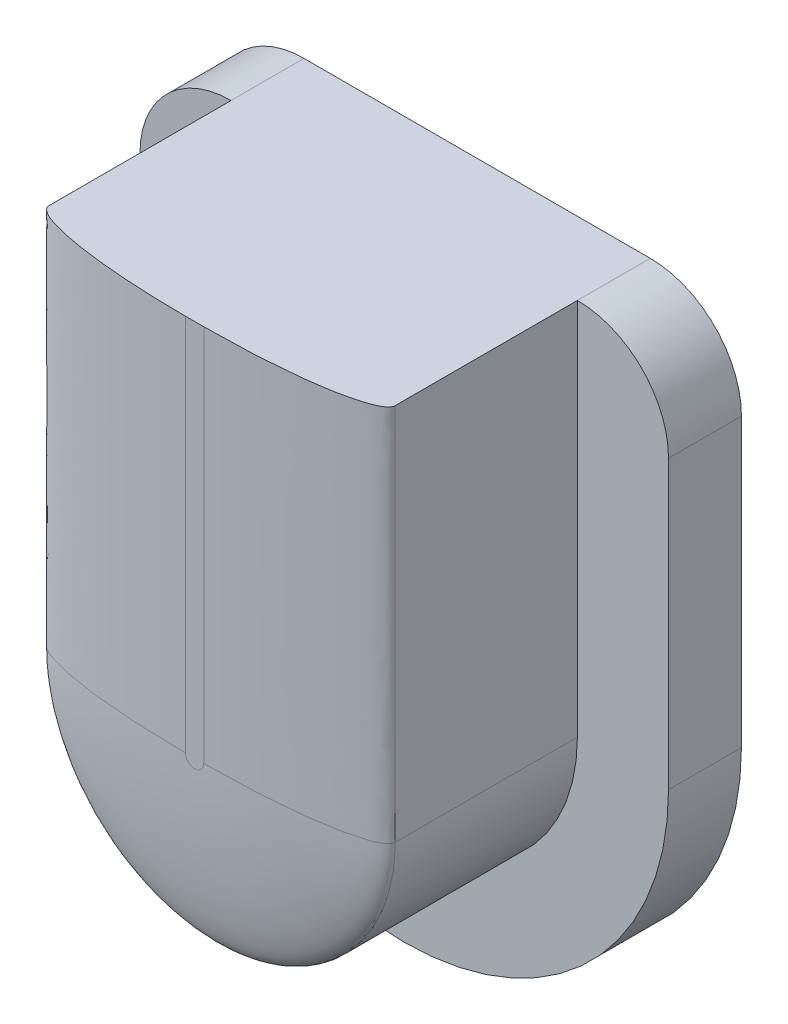
ISO-10303-21;
HEADER;
FILE_DESCRIPTION(('STEP AP214'),'2;1');
FILE_NAME('part.step','',(''),(''),'','','');
FILE_SCHEMA(('AUTOMOTIVE_DESIGN { 1 0 10303 214 1 1 1 1 }'));
ENDSEC;
DATA;
#1=APPLICATION_CONTEXT('core data for automotive mechanical design processes');
#2=APPLICATION_PROTOCOL_DEFINITION('international standard','automotive_design',2000,#1);
#3=PRODUCT_CONTEXT('',#1,'mechanical');
#4=PRODUCT('Part','Part','',(#3));
#5=PRODUCT_RELATED_PRODUCT_CATEGORY('part','',(#4));
#6=PRODUCT_DEFINITION_FORMATION('','',#4);
#7=PRODUCT_DEFINITION_CONTEXT('part definition',#1,'design');
#8=PRODUCT_DEFINITION('design','',#6,#7);
#9=PRODUCT_DEFINITION_SHAPE('','',#8);
#10=(LENGTH_UNIT() NAMED_UNIT(*) SI_UNIT(.MILLI.,.METRE.));
#11=(NAMED_UNIT(*) PLANE_ANGLE_UNIT() SI_UNIT($,.RADIAN.));
#12=(NAMED_UNIT(*) SI_UNIT($,.STERADIAN.) SOLID_ANGLE_UNIT());
#13=UNCERTAINTY_MEASURE_WITH_UNIT(LENGTH_MEASURE(1.E-05),#10,'distance_accuracy_value','');
#14=(GEOMETRIC_REPRESENTATION_CONTEXT(3) GLOBAL_UNCERTAINTY_ASSIGNED_CONTEXT((#13)) GLOBAL_UNIT_ASSIGNED_CONTEXT((#10,
#11,#12)) REPRESENTATION_CONTEXT('',''));
#15=CARTESIAN_POINT('',(0.,0.,0.));
#16=DIRECTION('',(0.,0.,1.));
#17=DIRECTION('',(1.,0.,0.));
#18=AXIS2_PLACEMENT_3D('',#15,#16,#17);
#19=CARTESIAN_POINT('',(0.600000000000001,-78.2729999997179,3.1));
#20=DIRECTION('',(0.,0.,-1.));
#21=DIRECTION('',(-1.,0.,0.));
#22=AXIS2_PLACEMENT_3D('',#19,#20,#21);
#23=CYLINDRICAL_SURFACE('',#22,1.9);
#24=DIRECTION('',(0.,0.,-1.));
#25=VECTOR('',#24,1.);
#26=CARTESIAN_POINT('',(2.5,-78.2729999997179,3.1));
#27=LINE('',#26,#25);
#28=CARTESIAN_POINT('',(2.5,-78.2729999997179,2.8));
#29=VERTEX_POINT('',#28);
#30=CARTESIAN_POINT('',(2.5,-78.2729999997179,0.800000000000001));
#31=VERTEX_POINT('',#30);
#32=EDGE_CURVE('E252',#29,#31,#27,.T.);
#33=ORIENTED_EDGE('',*,*,#32,.F.);
#34=CARTESIAN_POINT('',(-1.3,-78.2729999997179,2.8));
#35=CARTESIAN_POINT('',(-1.3,-78.5217513835236,2.8));
#36=CARTESIAN_POINT('',(-1.25054649939496,-78.7703248096067,2.8));
#37=CARTESIAN_POINT('',(-1.06019572414801,-79.2298722328163,2.8));
#38=CARTESIAN_POINT('',(-0.919364069502486,-79.4406416987243,2.8));
#39=CARTESIAN_POINT('',(-0.567641699006299,-79.7923640692205,2.8));
#40=CARTESIAN_POINT('',(-0.356872233098459,-79.9331957238659,2.8));
#41=CARTESIAN_POINT('',(0.102675190111133,-80.1235464991129,2.8));
#42=CARTESIAN_POINT('',(0.351294726727069,-80.1729999997179,2.8));
#43=CARTESIAN_POINT('',(0.848705273272936,-80.1729999997179,2.8));
#44=CARTESIAN_POINT('',(1.09732480988882,-80.1235464991129,2.8));
#45=CARTESIAN_POINT('',(1.5568722330985,-79.9331957238658,2.8));
#46=CARTESIAN_POINT('',(1.76764169900635,-79.7923640692205,2.8));
#47=CARTESIAN_POINT('',(2.11936406950244,-79.4406416987244,2.8));
#48=CARTESIAN_POINT('',(2.26019572414801,-79.2298722328163,2.8));
#49=CARTESIAN_POINT('',(2.45054649939496,-78.7703248096067,2.8));
#50=CARTESIAN_POINT('',(2.5,-78.5217513835236,2.8));
#51=CARTESIAN_POINT('',(2.5,-78.2729999997179,2.8));
#52=(BOUNDED_CURVE() B_SPLINE_CURVE(3,(#34,#35,#36,#37,#38,#39,#40,#41,#42,#43,#44,#45,#46,#47,
#48,#49,#50,#51),.UNSPECIFIED.,.F.,.F.) B_SPLINE_CURVE_WITH_KNOTS((4,2,2,2,2,2,2,2,4),
(3.14159265358979,3.53429173528852,3.92699081698724,4.31968989868597,4.71238898038469,
5.10508806208341,5.49778714378214,5.89048622548086,6.28318530717959),
.UNSPECIFIED.) CURVE() GEOMETRIC_REPRESENTATION_ITEM() RATIONAL_B_SPLINE_CURVE((1.,1.,1.,1.,1.,
1.,1.,1.,1.,1.,1.,1.,1.,1.,1.,1.,1.,1.)) REPRESENTATION_ITEM(''));
#53=CARTESIAN_POINT('',(-1.3,-78.2729999997179,2.8));
#54=VERTEX_POINT('',#53);
#55=EDGE_CURVE('E153',#29,#54,#52,.F.);
#56=ORIENTED_EDGE('',*,*,#55,.T.);
#57=DIRECTION('',(0.,0.,-1.));
#58=VECTOR('',#57,1.);
#59=CARTESIAN_POINT('',(-1.3,-78.2729999997179,3.1));
#60=LINE('',#59,#58);
#61=CARTESIAN_POINT('',(-1.3,-78.2729999997179,0.800000000000001));
#62=VERTEX_POINT('',#61);
#63=EDGE_CURVE('E255',#54,#62,#60,.T.);
#64=ORIENTED_EDGE('',*,*,#63,.T.);
#65=CARTESIAN_POINT('',(0.600000000000001,-78.2729999997179,0.8));
#66=DIRECTION('',(0.,0.,-1.));
#67=DIRECTION('',(-1.,0.,0.));
#68=AXIS2_PLACEMENT_3D('',#65,#66,#67);
#69=CIRCLE('',#68,1.9);
#70=EDGE_CURVE('E263',#31,#62,#69,.T.);
#71=ORIENTED_EDGE('',*,*,#70,.F.);
#72=EDGE_LOOP('',(#33,#56,#64,#71));
#73=FACE_BOUND('',#72,.T.);
#74=ADVANCED_FACE('F40',(#73),#23,.T.);
#75=CARTESIAN_POINT('',(2.5,-78.2729999997179,3.1));
#76=DIRECTION('',(-1.,0.,0.));
#77=DIRECTION('',(0.,-1.,0.));
#78=AXIS2_PLACEMENT_3D('',#75,#76,#77);
#79=PLANE('',#78);
#80=DIRECTION('',(0.,-1.,0.));
#81=VECTOR('',#80,1.);
#82=CARTESIAN_POINT('',(2.5,-78.2729999997179,0.8));
#83=LINE('',#82,#81);
#84=CARTESIAN_POINT('',(2.5,-74.1229995629388,0.800000000000001));
#85=VERTEX_POINT('',#84);
#86=EDGE_CURVE('E143',#85,#31,#83,.T.);
#87=ORIENTED_EDGE('',*,*,#86,.F.);
#88=DIRECTION('',(0.,0.,1.));
#89=VECTOR('',#88,1.);
#90=CARTESIAN_POINT('',(2.5,-74.1229995629388,3.1));
#91=LINE('',#90,#89);
#92=CARTESIAN_POINT('',(2.5,-74.1229995629388,2.8));
#93=VERTEX_POINT('',#92);
#94=EDGE_CURVE('E126',#85,#93,#91,.T.);
#95=ORIENTED_EDGE('',*,*,#94,.T.);
#96=CARTESIAN_POINT('',(2.5,-78.2729999997179,2.8));
#97=CARTESIAN_POINT('',(2.5,-72.7396660840124,2.8));
#98=CARTESIAN_POINT('',(2.5,-67.2063321683071,2.8));
#99=CARTESIAN_POINT('',(2.5,-61.6729982526016,2.8));
#100=(BOUNDED_CURVE() B_SPLINE_CURVE(3,(#96,#97,#98,#99),.UNSPECIFIED.,.F.,
.F.) B_SPLINE_CURVE_WITH_KNOTS((4,4),(-0.0166000017471164,0.),
.UNSPECIFIED.) CURVE() GEOMETRIC_REPRESENTATION_ITEM() RATIONAL_B_SPLINE_CURVE((1.,1.,1.,1.)) REPRESENTATION_ITEM(''));
#101=EDGE_CURVE('E140',#93,#29,#100,.F.);
#102=ORIENTED_EDGE('',*,*,#101,.T.);
#103=ORIENTED_EDGE('',*,*,#32,.T.);
#104=EDGE_LOOP('',(#87,#95,#102,#103));
#105=FACE_BOUND('',#104,.T.);
#106=ADVANCED_FACE('F138',(#105),#79,.F.);
#107=CARTESIAN_POINT('',(-1.3,-78.2729999997179,3.1));
#108=DIRECTION('',(1.,0.,0.));
#109=DIRECTION('',(0.,0.,-1.));
#110=AXIS2_PLACEMENT_3D('',#107,#108,#109);
#111=PLANE('',#110);
#112=CARTESIAN_POINT('',(-1.3,-61.6729982526016,2.8));
#113=CARTESIAN_POINT('',(-1.3,-67.2063321683071,2.8));
#114=CARTESIAN_POINT('',(-1.3,-72.7396660840124,2.8));
#115=CARTESIAN_POINT('',(-1.3,-78.2729999997179,2.8));
#116=(BOUNDED_CURVE() B_SPLINE_CURVE(3,(#112,#113,#114,#115),.UNSPECIFIED.,.F.,
.F.) B_SPLINE_CURVE_WITH_KNOTS((4,4),(0.,0.0166000017471164),
.UNSPECIFIED.) CURVE() GEOMETRIC_REPRESENTATION_ITEM() RATIONAL_B_SPLINE_CURVE((1.,1.,1.,1.)) REPRESENTATION_ITEM(''));
#117=CARTESIAN_POINT('',(-1.3,-74.1229995629388,2.8));
#118=VERTEX_POINT('',#117);
#119=EDGE_CURVE('E444',#54,#118,#116,.F.);
#120=ORIENTED_EDGE('',*,*,#119,.T.);
#121=DIRECTION('',(0.,0.,-1.));
#122=VECTOR('',#121,1.);
#123=CARTESIAN_POINT('',(-1.3,-74.1229995629388,3.1));
#124=LINE('',#123,#122);
#125=CARTESIAN_POINT('',(-1.3,-74.1229995629388,0.8));
#126=VERTEX_POINT('',#125);
#127=EDGE_CURVE('E335',#118,#126,#124,.T.);
#128=ORIENTED_EDGE('',*,*,#127,.T.);
#129=DIRECTION('',(0.,1.,0.));
#130=VECTOR('',#129,1.);
#131=CARTESIAN_POINT('',(-1.3,-78.2729999997179,0.8));
#132=LINE('',#131,#130);
#133=EDGE_CURVE('E269',#62,#126,#132,.T.);
#134=ORIENTED_EDGE('',*,*,#133,.F.);
#135=ORIENTED_EDGE('',*,*,#63,.F.);
#136=EDGE_LOOP('',(#120,#128,#134,#135));
#137=FACE_BOUND('',#136,.T.);
#138=ADVANCED_FACE('F233',(#137),#111,.F.);
#139=CARTESIAN_POINT('',(0.600000000000001,-78.2729999997179,3.1));
#140=DIRECTION('',(0.,0.,1.));
#141=DIRECTION('',(1.,0.,0.));
#142=AXIS2_PLACEMENT_3D('',#139,#140,#141);
#143=PLANE('',#142);
#144=DIRECTION('',(1.,0.,0.));
#145=VECTOR('',#144,1.);
#146=CARTESIAN_POINT('',(0.600000000000001,-74.1229995629388,3.1));
#147=LINE('',#146,#145);
#148=CARTESIAN_POINT('',(0.5,-74.1229995629388,3.1));
#149=VERTEX_POINT('',#148);
#150=CARTESIAN_POINT('',(0.700000000000001,-74.1229995629388,3.1));
#151=VERTEX_POINT('',#150);
#152=EDGE_CURVE('E129',#149,#151,#147,.T.);
#153=ORIENTED_EDGE('',*,*,#152,.F.);
#154=CARTESIAN_POINT('',(0.5,-78.2729999997179,3.1));
#155=CARTESIAN_POINT('',(0.5,-72.7396660840124,3.1));
#156=CARTESIAN_POINT('',(0.5,-67.2063321683071,3.1));
#157=CARTESIAN_POINT('',(0.5,-61.6729982526016,3.1));
#158=(BOUNDED_CURVE() B_SPLINE_CURVE(3,(#154,#155,#156,#157),.UNSPECIFIED.,.F.,
.F.) B_SPLINE_CURVE_WITH_KNOTS((4,4),(0.,0.0166000017471164),
.UNSPECIFIED.) CURVE() GEOMETRIC_REPRESENTATION_ITEM() RATIONAL_B_SPLINE_CURVE((1.,1.,1.,1.)) REPRESENTATION_ITEM(''));
#159=CARTESIAN_POINT('',(0.5,-78.2729999997179,3.1));
#160=VERTEX_POINT('',#159);
#161=EDGE_CURVE('E272',#149,#160,#158,.F.);
#162=ORIENTED_EDGE('',*,*,#161,.T.);
#163=CARTESIAN_POINT('',(0.700000000000001,-78.2729999997179,3.1));
#164=CARTESIAN_POINT('',(0.699999996727121,-78.2860921778099,3.1));
#165=CARTESIAN_POINT('',(0.697397184178676,-78.2991749897121,3.1));
#166=CARTESIAN_POINT('',(0.687378722323582,-78.3233616961968,3.1));
#167=CARTESIAN_POINT('',(0.679966529973821,-78.3344548259814,3.1));
#168=CARTESIAN_POINT('',(0.66145482626349,-78.3529665296917,3.1));
#169=CARTESIAN_POINT('',(0.650361696478852,-78.3603787220415,3.1));
#170=CARTESIAN_POINT('',(0.626174989994167,-78.3703971838967,3.1));
#171=CARTESIAN_POINT('',(0.613089751224892,-78.3729999997179,3.1));
#172=CARTESIAN_POINT('',(0.586910248775109,-78.3729999997179,3.1));
#173=CARTESIAN_POINT('',(0.573825010005833,-78.3703971838967,3.1));
#174=CARTESIAN_POINT('',(0.54963830352115,-78.3603787220415,3.1));
#175=CARTESIAN_POINT('',(0.538545173736512,-78.3529665296917,3.1));
#176=CARTESIAN_POINT('',(0.52003347002618,-78.3344548259814,3.1));
#177=CARTESIAN_POINT('',(0.512621277676419,-78.3233616961968,3.1));
#178=CARTESIAN_POINT('',(0.502602815821325,-78.2991749897121,3.1));
#179=CARTESIAN_POINT('',(0.50000000327288,-78.2860921778099,3.1));
#180=CARTESIAN_POINT('',(0.5,-78.2729999997179,3.1));
#181=(BOUNDED_CURVE() B_SPLINE_CURVE(3,(#163,#164,#165,#166,#167,#168,#169,#170,#171,#172,#173,
#174,#175,#176,#177,#178,#179,#180),.UNSPECIFIED.,.F.,.F.) B_SPLINE_CURVE_WITH_KNOTS((4,2,2,2,2,
2,2,2,4),(3.14159265358979,3.53429173528852,3.92699081698724,4.31968989868597,4.71238898038469,
5.10508806208341,5.49778714378214,5.89048622548086,6.28318530717959),
.UNSPECIFIED.) CURVE() GEOMETRIC_REPRESENTATION_ITEM() RATIONAL_B_SPLINE_CURVE((1.,1.,1.,1.,1.,
1.,1.,1.,1.,1.,1.,1.,1.,1.,1.,1.,1.,1.)) REPRESENTATION_ITEM(''));
#182=CARTESIAN_POINT('',(0.700000000000001,-78.2729999997179,3.1));
#183=VERTEX_POINT('',#182);
#184=EDGE_CURVE('E219',#160,#183,#181,.F.);
#185=ORIENTED_EDGE('',*,*,#184,.T.);
#186=CARTESIAN_POINT('',(0.7,-61.6729982526016,3.1));
#187=CARTESIAN_POINT('',(0.7,-67.2063321683071,3.1));
#188=CARTESIAN_POINT('',(0.700000000000001,-72.7396660840124,3.1));
#189=CARTESIAN_POINT('',(0.700000000000001,-78.2729999997179,3.1));
#190=(BOUNDED_CURVE() B_SPLINE_CURVE(3,(#186,#187,#188,#189),.UNSPECIFIED.,.F.,
.F.) B_SPLINE_CURVE_WITH_KNOTS((4,4),(-0.0166000017471164,0.),
.UNSPECIFIED.) CURVE() GEOMETRIC_REPRESENTATION_ITEM() RATIONAL_B_SPLINE_CURVE((1.,1.,1.,1.)) REPRESENTATION_ITEM(''));
#191=EDGE_CURVE('E154',#183,#151,#190,.F.);
#192=ORIENTED_EDGE('',*,*,#191,.T.);
#193=EDGE_LOOP('',(#153,#162,#185,#192));
#194=FACE_BOUND('',#193,.T.);
#195=ADVANCED_FACE('F242',(#194),#143,.T.);
#196=CARTESIAN_POINT('',(0.600000000000001,-78.2729999997179,0.8));
#197=DIRECTION('',(0.,0.,-1.));
#198=DIRECTION('',(-1.,0.,0.));
#199=AXIS2_PLACEMENT_3D('',#196,#197,#198);
#200=PLANE('',#199);
#201=ORIENTED_EDGE('',*,*,#133,.T.);
#202=CARTESIAN_POINT('',(-1.3,-75.1229995629388,0.8));
#203=DIRECTION('',(0.,0.,-1.));
#204=DIRECTION('',(-1.,0.,0.));
#205=AXIS2_PLACEMENT_3D('',#202,#203,#204);
#206=CIRCLE('',#205,1.);
#207=CARTESIAN_POINT('',(-2.3,-75.1229995629388,0.8));
#208=VERTEX_POINT('',#207);
#209=EDGE_CURVE('E48',#126,#208,#206,.F.);
#210=ORIENTED_EDGE('',*,*,#209,.T.);
#211=DIRECTION('',(0.,1.,0.));
#212=VECTOR('',#211,1.);
#213=CARTESIAN_POINT('',(-2.3,-78.2729999997179,0.8));
#214=LINE('',#213,#212);
#215=CARTESIAN_POINT('',(-2.3,-78.2729999997179,0.8));
#216=VERTEX_POINT('',#215);
#217=EDGE_CURVE('E408',#216,#208,#214,.T.);
#218=ORIENTED_EDGE('',*,*,#217,.F.);
#219=CARTESIAN_POINT('',(0.600000000000001,-78.2729999997179,0.8));
#220=DIRECTION('',(0.,0.,-1.));
#221=DIRECTION('',(-1.,0.,0.));
#222=AXIS2_PLACEMENT_3D('',#219,#220,#221);
#223=CIRCLE('',#222,2.9);
#224=CARTESIAN_POINT('',(3.5,-78.2729999997179,0.8));
#225=VERTEX_POINT('',#224);
#226=EDGE_CURVE('E419',#225,#216,#223,.T.);
#227=ORIENTED_EDGE('',*,*,#226,.F.);
#228=DIRECTION('',(0.,-1.,0.));
#229=VECTOR('',#228,1.);
#230=CARTESIAN_POINT('',(3.5,-61.6729982526016,0.8));
#231=LINE('',#230,#229);
#232=CARTESIAN_POINT('',(3.5,-75.1229995629388,0.8));
#233=VERTEX_POINT('',#232);
#234=EDGE_CURVE('E418',#233,#225,#231,.T.);
#235=ORIENTED_EDGE('',*,*,#234,.F.);
#236=CARTESIAN_POINT('',(2.5,-75.1229995629388,0.8));
#237=DIRECTION('',(0.,0.,-1.));
#238=DIRECTION('',(-1.,0.,0.));
#239=AXIS2_PLACEMENT_3D('',#236,#237,#238);
#240=CIRCLE('',#239,1.);
#241=EDGE_CURVE('E403',#233,#85,#240,.F.);
#242=ORIENTED_EDGE('',*,*,#241,.T.);
#243=ORIENTED_EDGE('',*,*,#86,.T.);
#244=ORIENTED_EDGE('',*,*,#70,.T.);
#245=EDGE_LOOP('',(#201,#210,#218,#227,#235,#242,#243,#244));
#246=FACE_BOUND('',#245,.T.);
#247=ADVANCED_FACE('F285',(#246),#200,.F.);
#248=CARTESIAN_POINT('',(0.600000000000001,-78.2729999997179,0.8));
#249=DIRECTION('',(0.,0.,-1.));
#250=DIRECTION('',(-1.,0.,0.));
#251=AXIS2_PLACEMENT_3D('',#248,#249,#250);
#252=CYLINDRICAL_SURFACE('',#251,2.9);
#253=CARTESIAN_POINT('',(0.600000000000001,-78.2729999997179,0.));
#254=DIRECTION('',(0.,0.,-1.));
#255=DIRECTION('',(-1.,0.,0.));
#256=AXIS2_PLACEMENT_3D('',#253,#254,#255);
#257=CIRCLE('',#256,2.9);
#258=CARTESIAN_POINT('',(3.5,-78.2729999997179,0.));
#259=VERTEX_POINT('',#258);
#260=CARTESIAN_POINT('',(-2.3,-78.2729999997179,0.));
#261=VERTEX_POINT('',#260);
#262=EDGE_CURVE('E433',#259,#261,#257,.T.);
#263=ORIENTED_EDGE('',*,*,#262,.F.);
#264=DIRECTION('',(0.,0.,-1.));
#265=VECTOR('',#264,1.);
#266=CARTESIAN_POINT('',(3.5,-78.2729999997179,0.8));
#267=LINE('',#266,#265);
#268=EDGE_CURVE('E437',#225,#259,#267,.T.);
#269=ORIENTED_EDGE('',*,*,#268,.F.);
#270=ORIENTED_EDGE('',*,*,#226,.T.);
#271=DIRECTION('',(0.,0.,-1.));
#272=VECTOR('',#271,1.);
#273=CARTESIAN_POINT('',(-2.3,-78.2729999997179,0.8));
#274=LINE('',#273,#272);
#275=EDGE_CURVE('E417',#216,#261,#274,.T.);
#276=ORIENTED_EDGE('',*,*,#275,.T.);
#277=EDGE_LOOP('',(#263,#269,#270,#276));
#278=FACE_BOUND('',#277,.T.);
#279=ADVANCED_FACE('F286',(#278),#252,.T.);
#280=CARTESIAN_POINT('',(3.5,-61.6729982526016,0.8));
#281=DIRECTION('',(1.,0.,0.));
#282=DIRECTION('',(0.,0.,-1.));
#283=AXIS2_PLACEMENT_3D('',#280,#281,#282);
#284=PLANE('',#283);
#285=DIRECTION('',(0.,-1.,0.));
#286=VECTOR('',#285,1.);
#287=CARTESIAN_POINT('',(3.5,-61.6729982526016,0.));
#288=LINE('',#287,#286);
#289=CARTESIAN_POINT('',(3.5,-75.1229995629388,0.));
#290=VERTEX_POINT('',#289);
#291=EDGE_CURVE('E430',#290,#259,#288,.T.);
#292=ORIENTED_EDGE('',*,*,#291,.F.);
#293=DIRECTION('',(0.,0.,-1.));
#294=VECTOR('',#293,1.);
#295=CARTESIAN_POINT('',(3.5,-75.1229995629388,0.800000000000001));
#296=LINE('',#295,#294);
#297=EDGE_CURVE('E12',#290,#233,#296,.F.);
#298=ORIENTED_EDGE('',*,*,#297,.T.);
#299=ORIENTED_EDGE('',*,*,#234,.T.);
#300=ORIENTED_EDGE('',*,*,#268,.T.);
#301=EDGE_LOOP('',(#292,#298,#299,#300));
#302=FACE_BOUND('',#301,.T.);
#303=ADVANCED_FACE('F305',(#302),#284,.T.);
#304=CARTESIAN_POINT('',(-2.3,-78.2729999997179,0.8));
#305=DIRECTION('',(-1.,0.,0.));
#306=DIRECTION('',(0.,-1.,0.));
#307=AXIS2_PLACEMENT_3D('',#304,#305,#306);
#308=PLANE('',#307);
#309=ORIENTED_EDGE('',*,*,#217,.T.);
#310=DIRECTION('',(0.,0.,-1.));
#311=VECTOR('',#310,1.);
#312=CARTESIAN_POINT('',(-2.3,-75.1229995629388,0.));
#313=LINE('',#312,#311);
#314=CARTESIAN_POINT('',(-2.3,-75.1229995629388,0.));
#315=VERTEX_POINT('',#314);
#316=EDGE_CURVE('E134',#208,#315,#313,.T.);
#317=ORIENTED_EDGE('',*,*,#316,.T.);
#318=DIRECTION('',(0.,1.,0.));
#319=VECTOR('',#318,1.);
#320=CARTESIAN_POINT('',(-2.3,-78.2729999997179,0.));
#321=LINE('',#320,#319);
#322=EDGE_CURVE('E423',#261,#315,#321,.T.);
#323=ORIENTED_EDGE('',*,*,#322,.F.);
#324=ORIENTED_EDGE('',*,*,#275,.F.);
#325=EDGE_LOOP('',(#309,#317,#323,#324));
#326=FACE_BOUND('',#325,.T.);
#327=ADVANCED_FACE('F307',(#326),#308,.T.);
#328=CARTESIAN_POINT('',(0.600000000000001,-78.2729999997179,0.));
#329=DIRECTION('',(0.,0.,1.));
#330=DIRECTION('',(1.,0.,0.));
#331=AXIS2_PLACEMENT_3D('',#328,#329,#330);
#332=PLANE('',#331);
#333=CARTESIAN_POINT('',(0.600000000000001,-78.2729999997179,0.));
#334=DIRECTION('',(0.,0.,1.));
#335=DIRECTION('',(1.,0.,0.));
#336=AXIS2_PLACEMENT_3D('',#333,#334,#335);
#337=CIRCLE('',#336,1.99674942128283);
#338=CARTESIAN_POINT('',(2.59674942128283,-78.2729999997179,0.));
#339=VERTEX_POINT('',#338);
#340=EDGE_CURVE('E383',#339,#339,#337,.T.);
#341=ORIENTED_EDGE('',*,*,#340,.T.);
#342=EDGE_LOOP('',(#341));
#343=FACE_BOUND('',#342,.T.);
#344=ORIENTED_EDGE('',*,*,#322,.T.);
#345=CARTESIAN_POINT('',(-1.3,-75.1229995629388,0.));
#346=DIRECTION('',(0.,0.,1.));
#347=DIRECTION('',(1.,0.,0.));
#348=AXIS2_PLACEMENT_3D('',#345,#346,#347);
#349=CIRCLE('',#348,1.);
#350=CARTESIAN_POINT('',(-1.3,-74.1229995629388,0.));
#351=VERTEX_POINT('',#350);
#352=EDGE_CURVE('E397',#315,#351,#349,.F.);
#353=ORIENTED_EDGE('',*,*,#352,.T.);
#354=DIRECTION('',(1.,0.,0.));
#355=VECTOR('',#354,1.);
#356=CARTESIAN_POINT('',(0.600000000000001,-74.1229995629388,0.));
#357=LINE('',#356,#355);
#358=CARTESIAN_POINT('',(2.5,-74.1229995629388,0.));
#359=VERTEX_POINT('',#358);
#360=EDGE_CURVE('E421',#351,#359,#357,.T.);
#361=ORIENTED_EDGE('',*,*,#360,.T.);
#362=CARTESIAN_POINT('',(2.5,-75.1229995629388,0.));
#363=DIRECTION('',(0.,0.,1.));
#364=DIRECTION('',(1.,0.,0.));
#365=AXIS2_PLACEMENT_3D('',#362,#363,#364);
#366=CIRCLE('',#365,1.);
#367=EDGE_CURVE('E61',#359,#290,#366,.F.);
#368=ORIENTED_EDGE('',*,*,#367,.T.);
#369=ORIENTED_EDGE('',*,*,#291,.T.);
#370=ORIENTED_EDGE('',*,*,#262,.T.);
#371=EDGE_LOOP('',(#344,#353,#361,#368,#369,#370));
#372=FACE_BOUND('',#371,.T.);
#373=ADVANCED_FACE('F244',(#343,#372),#332,.F.);
#374=CARTESIAN_POINT('',(-1.3,-78.2729999997179,2.8));
#375=CARTESIAN_POINT('',(-1.3,-72.7396660840124,2.8));
#376=CARTESIAN_POINT('',(-1.3,-67.2063321683071,2.8));
#377=CARTESIAN_POINT('',(-1.3,-61.6729982526016,2.8));
#378=CARTESIAN_POINT('',(-1.3,-78.2729999997179,3.1));
#379=CARTESIAN_POINT('',(-1.3,-72.7396660840124,3.1));
#380=CARTESIAN_POINT('',(-1.3,-67.2063321683071,3.1));
#381=CARTESIAN_POINT('',(-1.3,-61.6729982526016,3.1));
#382=CARTESIAN_POINT('',(0.5,-78.2729999997179,3.1));
#383=CARTESIAN_POINT('',(0.5,-72.7396660840124,3.1));
#384=CARTESIAN_POINT('',(0.5,-67.2063321683071,3.1));
#385=CARTESIAN_POINT('',(0.5,-61.6729982526016,3.1));
#386=(BOUNDED_SURFACE() B_SPLINE_SURFACE(2,3,((#374,#375,#376,#377),(#378,#379,#380,#381),(#382,
#383,#384,#385)),.UNSPECIFIED.,.F.,.F.,.F.) B_SPLINE_SURFACE_WITH_KNOTS((3,3),(4,4),(0.,1.),(0.,
0.0166000017471164),
.UNSPECIFIED.) GEOMETRIC_REPRESENTATION_ITEM() RATIONAL_B_SPLINE_SURFACE(((1.,1.,1.,1.),
(0.707106781186548,0.707106781186548,0.707106781186548,0.707106781186548),(1.,1.,1.,1.))) REPRESENTATION_ITEM('') SURFACE());
#387=CARTESIAN_POINT('',(-1.3,-74.1229995629388,2.8));
#388=CARTESIAN_POINT('',(-1.30002810450264,-74.1229995629388,2.80642916042709));
#389=CARTESIAN_POINT('',(-1.29876657842228,-74.1229995629388,2.81260010567821));
#390=CARTESIAN_POINT('',(-1.29377625983821,-74.1229995629388,2.8260293609798));
#391=CARTESIAN_POINT('',(-1.28942986155063,-74.1229995629388,2.83307208868653));
#392=CARTESIAN_POINT('',(-1.27975059783973,-74.1229995629388,2.84527056842015));
#393=CARTESIAN_POINT('',(-1.27453666014946,-74.1229995629388,2.85053725945646));
#394=CARTESIAN_POINT('',(-1.26344912046388,-74.1229995629388,2.86035013062522));
#395=CARTESIAN_POINT('',(-1.25757395582169,-74.1229995629389,2.86489454004674));
#396=CARTESIAN_POINT('',(-1.24144386819273,-74.1229995629389,2.87625181422161));
#397=CARTESIAN_POINT('',(-1.23085858465254,-74.1229995629388,2.88258114550186));
#398=CARTESIAN_POINT('',(-1.20916765262411,-74.1229995629388,2.89429132562494));
#399=CARTESIAN_POINT('',(-1.19806087559655,-74.1229995629388,2.89966998495813));
#400=CARTESIAN_POINT('',(-1.17549028893925,-74.1229995629388,2.90977057846779));
#401=CARTESIAN_POINT('',(-1.16402499530572,-74.1229995629388,2.91448916206757));
#402=CARTESIAN_POINT('',(-1.14091196775607,-74.1229995629388,2.92340622173588));
#403=CARTESIAN_POINT('',(-1.1292644536676,-74.1229995629389,2.92760527712855));
#404=CARTESIAN_POINT('',(-1.09026117971445,-74.1229995629389,2.94092813830139));
#405=CARTESIAN_POINT('',(-1.06260808139106,-74.1229995629389,2.94917769347295));
#406=CARTESIAN_POINT('',(-1.0069198732425,-74.1229995629388,2.96431508676741));
#407=CARTESIAN_POINT('',(-0.978884422597025,-74.1229995629388,2.97120161182167));
#408=CARTESIAN_POINT('',(-0.922676520404713,-74.1229995629388,2.98395657289038));
#409=CARTESIAN_POINT('',(-0.894504773170423,-74.1229995629388,2.98982813067455));
#410=CARTESIAN_POINT('',(-0.838025646862627,-74.1229995629388,3.0008009031018));
#411=CARTESIAN_POINT('',(-0.809718325604275,-74.1229995629388,3.00590242036286));
#412=CARTESIAN_POINT('',(-0.728764180894644,-74.1229995629388,3.01958199670098));
#413=CARTESIAN_POINT('',(-0.675989862440953,-74.1229995629388,3.02740546934537));
#414=CARTESIAN_POINT('',(-0.570224631706965,-74.1229995629388,3.04147382155664));
#415=CARTESIAN_POINT('',(-0.517233667387936,-74.1229995629388,3.04771829607912));
#416=CARTESIAN_POINT('',(-0.3579533644993,-74.1229995629388,3.06456894375411));
#417=CARTESIAN_POINT('',(-0.251462702810008,-74.1229995629388,3.07327598328314));
#418=CARTESIAN_POINT('',(-0.0373989238489453,-74.1229995629388,3.08695299791594));
#419=CARTESIAN_POINT('',(0.0701760198560735,-74.1229995629388,3.09189240869082));
#420=CARTESIAN_POINT('',(0.231484484343413,-74.1229995629388,3.09678201386009));
#421=CARTESIAN_POINT('',(0.28518247911769,-74.1229995629388,3.09799201489744));
#422=CARTESIAN_POINT('',(0.392586834151523,-74.1229995629388,3.09959961885337));
#423=CARTESIAN_POINT('',(0.446293193535345,-74.1229995629388,3.09999728000829));
#424=CARTESIAN_POINT('',(0.5,-74.1229995629388,3.1));
#425=B_SPLINE_CURVE_WITH_KNOTS('',3,(#387,#388,#389,#390,#391,#392,#393,#394,#395,#396,#397,
#398,#399,#400,#401,#402,#403,#404,#405,#406,#407,#408,#409,#410,#411,#412,#413,#414,#415,#416,
#417,#418,#419,#420,#421,#422,#423,#424),.UNSPECIFIED.,.F.,.F.,(4,2,2,2,2,2,2,2,2,2,2,2,2,2,2,2,
2,2,4),(0.,0.0187643993675815,0.0430593585010969,0.0652377684901338,0.0874697381663899,
0.124381773946439,0.161377745094221,0.198555178064206,0.235690773643662,0.322195649247184,
0.408783457595686,0.495100013629169,0.581382559332259,0.741398729554506,0.901455905558937,
1.2218919082792,1.54490053798838,1.70603000782261,1.86714792594141),.UNSPECIFIED.);
#426=EDGE_CURVE('E145',#118,#149,#425,.T.);
#427=CARTESIAN_POINT('',(0.5,-78.2729999997179,3.1));
#428=CARTESIAN_POINT('',(-1.3,-78.2729999997179,3.1));
#429=CARTESIAN_POINT('',(-1.3,-78.2729999997179,2.8));
#430=(BOUNDED_CURVE() B_SPLINE_CURVE(2,(#427,#428,#429),.UNSPECIFIED.,.F.,
.F.) B_SPLINE_CURVE_WITH_KNOTS((3,3),(0.,1.),
.UNSPECIFIED.) CURVE() GEOMETRIC_REPRESENTATION_ITEM() RATIONAL_B_SPLINE_CURVE((1.,
0.707106781186547,1.)) REPRESENTATION_ITEM(''));
#431=EDGE_CURVE('E222',#160,#54,#430,.T.);
#432=ORIENTED_EDGE('',*,*,#426,.F.);
#433=ORIENTED_EDGE('',*,*,#119,.F.);
#434=ORIENTED_EDGE('',*,*,#431,.F.);
#435=ORIENTED_EDGE('',*,*,#161,.F.);
#436=EDGE_LOOP('',(#432,#433,#434,#435));
#437=FACE_BOUND('',#436,.T.);
#438=ADVANCED_FACE('F338',(#437),#386,.T.);
#439=CARTESIAN_POINT('',(0.5,-78.2729999997179,3.1));
#440=CARTESIAN_POINT('',(0.50000000327288,-78.2860921778099,3.1));
#441=CARTESIAN_POINT('',(0.502602815821325,-78.2991749897121,3.1));
#442=CARTESIAN_POINT('',(0.512621277676419,-78.3233616961968,3.1));
#443=CARTESIAN_POINT('',(0.52003347002618,-78.3344548259814,3.1));
#444=CARTESIAN_POINT('',(0.538545173736512,-78.3529665296917,3.1));
#445=CARTESIAN_POINT('',(0.54963830352115,-78.3603787220415,3.1));
#446=CARTESIAN_POINT('',(0.573825010005833,-78.3703971838967,3.1));
#447=CARTESIAN_POINT('',(0.586910248775109,-78.3729999997179,3.1));
#448=CARTESIAN_POINT('',(0.613089751224892,-78.3729999997179,3.1));
#449=CARTESIAN_POINT('',(0.626174989994167,-78.3703971838967,3.1));
#450=CARTESIAN_POINT('',(0.650361696478852,-78.3603787220415,3.1));
#451=CARTESIAN_POINT('',(0.66145482626349,-78.3529665296917,3.1));
#452=CARTESIAN_POINT('',(0.679966529973821,-78.3344548259814,3.1));
#453=CARTESIAN_POINT('',(0.687378722323582,-78.3233616961968,3.1));
#454=CARTESIAN_POINT('',(0.697397184178676,-78.2991749897121,3.1));
#455=CARTESIAN_POINT('',(0.699999996727121,-78.2860921778099,3.1));
#456=CARTESIAN_POINT('',(0.700000000000001,-78.2729999997179,3.1));
#457=CARTESIAN_POINT('',(-1.3,-78.2729999997179,3.1));
#458=CARTESIAN_POINT('',(-1.29999993781525,-78.5217513834656,3.1));
#459=CARTESIAN_POINT('',(-1.25054649939495,-78.7703248096067,3.1));
#460=CARTESIAN_POINT('',(-1.06019572414802,-79.2298722328163,3.1));
#461=CARTESIAN_POINT('',(-0.919364069502443,-79.4406416987243,3.1));
#462=CARTESIAN_POINT('',(-0.567641699006341,-79.7923640692206,3.1));
#463=CARTESIAN_POINT('',(-0.356872233098446,-79.9331957238658,3.1));
#464=CARTESIAN_POINT('',(0.102675190111119,-80.1235464991129,3.1));
#465=CARTESIAN_POINT('',(0.351294726727069,-80.1729999997179,3.1));
#466=CARTESIAN_POINT('',(0.848705273272936,-80.1729999997179,3.1));
#467=CARTESIAN_POINT('',(1.09732480988886,-80.123546499113,3.1));
#468=CARTESIAN_POINT('',(1.55687223309846,-79.9331957238657,3.1));
#469=CARTESIAN_POINT('',(1.76764169900634,-79.7923640692205,3.1));
#470=CARTESIAN_POINT('',(2.11936406950244,-79.4406416987244,3.1));
#471=CARTESIAN_POINT('',(2.26019572414802,-79.2298722328163,3.1));
#472=CARTESIAN_POINT('',(2.45054649939495,-78.7703248096067,3.1));
#473=CARTESIAN_POINT('',(2.49999993781529,-78.5217513834656,3.09999999999999));
#474=CARTESIAN_POINT('',(2.5,-78.2729999997179,3.1));
#475=CARTESIAN_POINT('',(-1.3,-78.2729999997179,2.8));
#476=CARTESIAN_POINT('',(-1.3,-78.5217513835236,2.8));
#477=CARTESIAN_POINT('',(-1.25054649939496,-78.7703248096067,2.8));
#478=CARTESIAN_POINT('',(-1.06019572414801,-79.2298722328163,2.8));
#479=CARTESIAN_POINT('',(-0.919364069502486,-79.4406416987243,2.8));
#480=CARTESIAN_POINT('',(-0.567641699006299,-79.7923640692205,2.8));
#481=CARTESIAN_POINT('',(-0.356872233098459,-79.9331957238659,2.8));
#482=CARTESIAN_POINT('',(0.102675190111133,-80.1235464991129,2.8));
#483=CARTESIAN_POINT('',(0.351294726727069,-80.1729999997179,2.8));
#484=CARTESIAN_POINT('',(0.848705273272936,-80.1729999997179,2.8));
#485=CARTESIAN_POINT('',(1.09732480988882,-80.1235464991129,2.8));
#486=CARTESIAN_POINT('',(1.5568722330985,-79.9331957238658,2.8));
#487=CARTESIAN_POINT('',(1.76764169900635,-79.7923640692205,2.8));
#488=CARTESIAN_POINT('',(2.11936406950244,-79.4406416987244,2.8));
#489=CARTESIAN_POINT('',(2.26019572414801,-79.2298722328163,2.8));
#490=CARTESIAN_POINT('',(2.45054649939496,-78.7703248096067,2.8));
#491=CARTESIAN_POINT('',(2.5,-78.5217513835236,2.8));
#492=CARTESIAN_POINT('',(2.5,-78.2729999997179,2.8));
#493=(BOUNDED_SURFACE() B_SPLINE_SURFACE(2,3,((#439,#440,#441,#442,#443,#444,#445,#446,#447,
#448,#449,#450,#451,#452,#453,#454,#455,#456),(#457,#458,#459,#460,#461,#462,#463,#464,#465,
#466,#467,#468,#469,#470,#471,#472,#473,#474),(#475,#476,#477,#478,#479,#480,#481,#482,#483,
#484,#485,#486,#487,#488,#489,#490,#491,#492)),.UNSPECIFIED.,.F.,.F.,
.F.) B_SPLINE_SURFACE_WITH_KNOTS((3,3),(4,2,2,2,2,2,2,2,4),(0.,1.),(3.14159265358979,
3.53429173528852,3.92699081698724,4.31968989868597,4.71238898038469,5.10508806208341,
5.49778714378214,5.89048622548086,6.28318530717959),
.UNSPECIFIED.) GEOMETRIC_REPRESENTATION_ITEM() RATIONAL_B_SPLINE_SURFACE(((1.,1.,1.,1.,1.,1.,1.,
1.,1.,1.,1.,1.,1.,1.,1.,1.,1.,1.),(0.707106781186547,0.707106781186547,0.707106781186547,
0.707106781186547,0.707106781186547,0.707106781186547,0.707106781186547,0.707106781186547,
0.707106781186547,0.707106781186547,0.707106781186547,0.707106781186547,0.707106781186547,
0.707106781186547,0.707106781186547,0.707106781186547,0.707106781186547,0.707106781186547),(1.,
1.,1.,1.,1.,1.,1.,1.,1.,1.,1.,1.,1.,1.,1.,1.,1.,1.))) REPRESENTATION_ITEM('') SURFACE());
#494=CARTESIAN_POINT('',(0.700000000000001,-78.2729999997179,3.1));
#495=CARTESIAN_POINT('',(2.5,-78.2729999997179,3.1));
#496=CARTESIAN_POINT('',(2.5,-78.2729999997179,2.8));
#497=(BOUNDED_CURVE() B_SPLINE_CURVE(2,(#494,#495,#496),.UNSPECIFIED.,.F.,
.F.) B_SPLINE_CURVE_WITH_KNOTS((3,3),(0.,1.),
.UNSPECIFIED.) CURVE() GEOMETRIC_REPRESENTATION_ITEM() RATIONAL_B_SPLINE_CURVE((1.,
0.707106781186548,1.)) REPRESENTATION_ITEM(''));
#498=EDGE_CURVE('E150',#183,#29,#497,.T.);
#499=ORIENTED_EDGE('',*,*,#431,.T.);
#500=ORIENTED_EDGE('',*,*,#55,.F.);
#501=ORIENTED_EDGE('',*,*,#498,.F.);
#502=ORIENTED_EDGE('',*,*,#184,.F.);
#503=EDGE_LOOP('',(#499,#500,#501,#502));
#504=FACE_BOUND('',#503,.T.);
#505=ADVANCED_FACE('F185',(#504),#493,.T.);
#506=CARTESIAN_POINT('',(2.5,-61.6729982526016,2.8));
#507=CARTESIAN_POINT('',(2.5,-67.2063321683071,2.8));
#508=CARTESIAN_POINT('',(2.5,-72.7396660840124,2.8));
#509=CARTESIAN_POINT('',(2.5,-78.2729999997179,2.8));
#510=CARTESIAN_POINT('',(2.5,-61.6729982526016,3.1));
#511=CARTESIAN_POINT('',(2.5000000000048,-67.2063321683071,3.1));
#512=CARTESIAN_POINT('',(2.5,-72.7396660840124,3.1));
#513=CARTESIAN_POINT('',(2.5,-78.2729999997179,3.1));
#514=CARTESIAN_POINT('',(0.7,-61.6729982526016,3.1));
#515=CARTESIAN_POINT('',(0.7,-67.2063321683071,3.1));
#516=CARTESIAN_POINT('',(0.700000000000001,-72.7396660840124,3.1));
#517=CARTESIAN_POINT('',(0.700000000000001,-78.2729999997179,3.1));
#518=(BOUNDED_SURFACE() B_SPLINE_SURFACE(2,3,((#506,#507,#508,#509),(#510,#511,#512,#513),(#514,
#515,#516,#517)),.UNSPECIFIED.,.F.,.F.,.F.) B_SPLINE_SURFACE_WITH_KNOTS((3,3),(4,4),(0.,1.),
(-0.0166000017471164,0.),
.UNSPECIFIED.) GEOMETRIC_REPRESENTATION_ITEM() RATIONAL_B_SPLINE_SURFACE(((1.,1.,1.,1.),
(0.707106781186547,0.707106781186547,0.707106781186548,0.707106781186548),(1.,1.,1.,1.))) REPRESENTATION_ITEM('') SURFACE());
#519=CARTESIAN_POINT('',(0.700000000000001,-74.1229995629388,3.1));
#520=CARTESIAN_POINT('',(0.774950314574917,-74.1229995629388,3.09998608157692));
#521=CARTESIAN_POINT('',(0.849902382852981,-74.1229995629388,3.09921898769901));
#522=CARTESIAN_POINT('',(0.999795417396674,-74.1229995629388,3.09608140188685));
#523=CARTESIAN_POINT('',(1.074736373348,-74.1229995629388,3.09371042223646));
#524=CARTESIAN_POINT('',(1.2248194114087,-74.1229995629388,3.08725619041238));
#525=CARTESIAN_POINT('',(1.2999612334572,-74.1229995629388,3.08316674080969));
#526=CARTESIAN_POINT('',(1.45010438635726,-74.1229995629388,3.07304372149305));
#527=CARTESIAN_POINT('',(1.52510573538078,-74.1229995629388,3.06701042364486));
#528=CARTESIAN_POINT('',(1.67649994381832,-74.1229995629388,3.05245039571746));
#529=CARTESIAN_POINT('',(1.75288816238641,-74.1229995629388,3.04387298140526));
#530=CARTESIAN_POINT('',(1.86710695977619,-74.1229995629388,3.02853481562307));
#531=CARTESIAN_POINT('',(1.90510408535977,-74.1229995629388,3.02301280520248));
#532=CARTESIAN_POINT('',(1.98093479083049,-74.1229995629388,3.01094862103611));
#533=CARTESIAN_POINT('',(2.0187683900791,-74.1229995629388,3.00440657166327));
#534=CARTESIAN_POINT('',(2.08256416252524,-74.1229995629388,2.99221536984245));
#535=CARTESIAN_POINT('',(2.10859219480389,-74.1229995629388,2.98691221982141));
#536=CARTESIAN_POINT('',(2.16047802027322,-74.1229995629388,2.97550390470451));
#537=CARTESIAN_POINT('',(2.18633579216514,-74.1229995629388,2.96939864119704));
#538=CARTESIAN_POINT('',(2.22970185351073,-74.1229995629388,2.95820790733604));
#539=CARTESIAN_POINT('',(2.24728195127211,-74.1229995629388,2.9534043392585));
#540=CARTESIAN_POINT('',(2.28224204918626,-74.1229995629388,2.9431536719557));
#541=CARTESIAN_POINT('',(2.29962214512876,-74.1229995629389,2.93770689617992));
#542=CARTESIAN_POINT('',(2.34071927947283,-74.1229995629389,2.92372438258506));
#543=CARTESIAN_POINT('',(2.36431505897147,-74.1229995629389,2.91480437418643));
#544=CARTESIAN_POINT('',(2.39848063706831,-74.1229995629388,2.89946581791655));
#545=CARTESIAN_POINT('',(2.40952018988144,-74.1229995629388,2.8941132125069));
#546=CARTESIAN_POINT('',(2.43105844805752,-74.1229995629388,2.88246054751627));
#547=CARTESIAN_POINT('',(2.44155855002566,-74.1229995629388,2.87616311919155));
#548=CARTESIAN_POINT('',(2.46037923663735,-74.1229995629388,2.86292636423234));
#549=CARTESIAN_POINT('',(2.46880986324767,-74.1229995629388,2.85615659302189));
#550=CARTESIAN_POINT('',(2.48016940561435,-74.1229995629388,2.84457829400716));
#551=CARTESIAN_POINT('',(2.48376460270975,-74.1229995629388,2.84044323134226));
#552=CARTESIAN_POINT('',(2.49017487471911,-74.1229995629388,2.83162087593448));
#553=CARTESIAN_POINT('',(2.49299384610572,-74.1229995629388,2.82693651620268));
#554=CARTESIAN_POINT('',(2.49764004833948,-74.1229995629388,2.81631707045878));
#555=CARTESIAN_POINT('',(2.49929959465824,-74.1229995629388,2.81029885243009));
#556=CARTESIAN_POINT('',(2.49994334008157,-74.1229995629388,2.80280638004785));
#557=CARTESIAN_POINT('',(2.50000365552413,-74.1229995629388,2.80140322202157));
#558=CARTESIAN_POINT('',(2.5,-74.1229995629388,2.8));
#559=B_SPLINE_CURVE_WITH_KNOTS('',3,(#519,#520,#521,#522,#523,#524,#525,#526,#527,#528,#529,
#530,#531,#532,#533,#534,#535,#536,#537,#538,#539,#540,#541,#542,#543,#544,#545,#546,#547,#548,
#549,#550,#551,#552,#553,#554,#555,#556,#557,#558),.UNSPECIFIED.,.F.,.F.,(4,2,2,2,2,2,2,2,2,2,2,
2,2,2,2,2,2,2,2,4),(0.,0.224849777939132,0.449767959870307,0.675504335971261,0.901209154376356,
1.13175292185409,1.24693213775565,1.36209732086858,1.44177659054703,1.52146564525089,
1.57612772854518,1.63076244007423,1.70631314966164,1.74308678949103,1.77975985603559,
1.81200081606829,1.8283814258925,1.84467824427785,1.86300899900232,1.86721829738165),.UNSPECIFIED.);
#560=EDGE_CURVE('E121',#151,#93,#559,.T.);
#561=ORIENTED_EDGE('',*,*,#560,.F.);
#562=ORIENTED_EDGE('',*,*,#191,.F.);
#563=ORIENTED_EDGE('',*,*,#498,.T.);
#564=ORIENTED_EDGE('',*,*,#101,.F.);
#565=EDGE_LOOP('',(#561,#562,#563,#564));
#566=FACE_BOUND('',#565,.T.);
#567=ADVANCED_FACE('F148',(#566),#518,.T.);
#568=CARTESIAN_POINT('',(0.600000000000001,-78.2729999997179,-1.05));
#569=DIRECTION('',(0.,0.,1.));
#570=DIRECTION('',(1.,0.,0.));
#571=AXIS2_PLACEMENT_3D('',#568,#569,#570);
#572=CYLINDRICAL_SURFACE('',#571,1.09674942128283);
#573=CARTESIAN_POINT('',(0.600000000000001,-78.2729999997179,-0.9));
#574=DIRECTION('',(0.,0.,1.));
#575=DIRECTION('',(1.,0.,0.));
#576=AXIS2_PLACEMENT_3D('',#573,#574,#575);
#577=CIRCLE('',#576,1.09674942128283);
#578=CARTESIAN_POINT('',(1.69674942128283,-78.2729999997179,-0.9));
#579=VERTEX_POINT('',#578);
#580=EDGE_CURVE('E135',#579,#579,#577,.F.);
#581=ORIENTED_EDGE('',*,*,#580,.T.);
#582=EDGE_LOOP('',(#581));
#583=FACE_BOUND('',#582,.T.);
#584=CARTESIAN_POINT('',(0.600000000000001,-78.2729999997179,-1.05));
#585=DIRECTION('',(0.,0.,-1.));
#586=DIRECTION('',(-1.,0.,0.));
#587=AXIS2_PLACEMENT_3D('',#584,#585,#586);
#588=CIRCLE('',#587,1.09674942128283);
#589=CARTESIAN_POINT('',(-0.496749421282834,-78.2729999997179,-1.05));
#590=VERTEX_POINT('',#589);
#591=EDGE_CURVE('E223',#590,#590,#588,.T.);
#592=ORIENTED_EDGE('',*,*,#591,.F.);
#593=EDGE_LOOP('',(#592));
#594=FACE_BOUND('',#593,.T.);
#595=ADVANCED_FACE('F184',(#583,#594),#572,.T.);
#596=CARTESIAN_POINT('',(0.600000000000001,-78.2729999997179,-1.05));
#597=DIRECTION('',(0.,0.,-1.));
#598=DIRECTION('',(-1.,0.,0.));
#599=AXIS2_PLACEMENT_3D('',#596,#597,#598);
#600=PLANE('',#599);
#601=ORIENTED_EDGE('',*,*,#591,.T.);
#602=EDGE_LOOP('',(#601));
#603=FACE_BOUND('',#602,.T.);
#604=ADVANCED_FACE('F318',(#603),#600,.T.);
#605=CARTESIAN_POINT('',(0.600000000000001,-78.2729999997179,-0.9));
#606=DIRECTION('',(0.,0.,1.));
#607=DIRECTION('',(1.,0.,0.));
#608=AXIS2_PLACEMENT_3D('',#605,#606,#607);
#609=TOROIDAL_SURFACE('',#608,1.99674942128283,0.9);
#610=ORIENTED_EDGE('',*,*,#340,.F.);
#611=EDGE_LOOP('',(#610));
#612=FACE_BOUND('',#611,.T.);
#613=ORIENTED_EDGE('',*,*,#580,.F.);
#614=EDGE_LOOP('',(#613));
#615=FACE_BOUND('',#614,.T.);
#616=ADVANCED_FACE('F321',(#612,#615),#609,.F.);
#617=CARTESIAN_POINT('',(-2.3,-74.1229995629388,3.105));
#618=DIRECTION('',(0.,-1.,0.));
#619=DIRECTION('',(0.,0.,-1.));
#620=AXIS2_PLACEMENT_3D('',#617,#618,#619);
#621=PLANE('',#620);
#622=ORIENTED_EDGE('',*,*,#360,.F.);
#623=DIRECTION('',(0.,0.,-1.));
#624=VECTOR('',#623,1.);
#625=CARTESIAN_POINT('',(-1.3,-74.1229995629388,0.800000000000001));
#626=LINE('',#625,#624);
#627=EDGE_CURVE('E401',#351,#126,#626,.F.);
#628=ORIENTED_EDGE('',*,*,#627,.T.);
#629=ORIENTED_EDGE('',*,*,#127,.F.);
#630=ORIENTED_EDGE('',*,*,#426,.T.);
#631=ORIENTED_EDGE('',*,*,#152,.T.);
#632=ORIENTED_EDGE('',*,*,#560,.T.);
#633=ORIENTED_EDGE('',*,*,#94,.F.);
#634=DIRECTION('',(0.,0.,-1.));
#635=VECTOR('',#634,1.);
#636=CARTESIAN_POINT('',(2.5,-74.1229995629388,0.));
#637=LINE('',#636,#635);
#638=EDGE_CURVE('E399',#85,#359,#637,.T.);
#639=ORIENTED_EDGE('',*,*,#638,.T.);
#640=EDGE_LOOP('',(#622,#628,#629,#630,#631,#632,#633,#639));
#641=FACE_BOUND('',#640,.T.);
#642=ADVANCED_FACE('F124',(#641),#621,.F.);
#643=CARTESIAN_POINT('',(-1.3,-75.1229995629388,0.8));
#644=DIRECTION('',(0.,0.,1.));
#645=DIRECTION('',(1.,0.,0.));
#646=AXIS2_PLACEMENT_3D('',#643,#644,#645);
#647=CYLINDRICAL_SURFACE('',#646,1.);
#648=ORIENTED_EDGE('',*,*,#209,.F.);
#649=ORIENTED_EDGE('',*,*,#627,.F.);
#650=ORIENTED_EDGE('',*,*,#352,.F.);
#651=ORIENTED_EDGE('',*,*,#316,.F.);
#652=EDGE_LOOP('',(#648,#649,#650,#651));
#653=FACE_BOUND('',#652,.T.);
#654=ADVANCED_FACE('F325',(#653),#647,.T.);
#655=CARTESIAN_POINT('',(2.5,-75.1229995629388,3.105));
#656=DIRECTION('',(0.,0.,1.));
#657=DIRECTION('',(1.,0.,0.));
#658=AXIS2_PLACEMENT_3D('',#655,#656,#657);
#659=CYLINDRICAL_SURFACE('',#658,1.);
#660=ORIENTED_EDGE('',*,*,#241,.F.);
#661=ORIENTED_EDGE('',*,*,#297,.F.);
#662=ORIENTED_EDGE('',*,*,#367,.F.);
#663=ORIENTED_EDGE('',*,*,#638,.F.);
#664=EDGE_LOOP('',(#660,#661,#662,#663));
#665=FACE_BOUND('',#664,.T.);
#666=ADVANCED_FACE('F42',(#665),#659,.T.);
#667=CLOSED_SHELL('',(#74,#106,#138,#195,#247,#279,#303,#327,#373,#438,#505,#567,#595,#604,#616,
#642,#654,#666));
#668=MANIFOLD_SOLID_BREP('B2',#667);
#669=ADVANCED_BREP_SHAPE_REPRESENTATION('',(#18,#668),#14);
#670=SHAPE_DEFINITION_REPRESENTATION(#9,#669);
ENDSEC;
END-ISO-10303-21;
